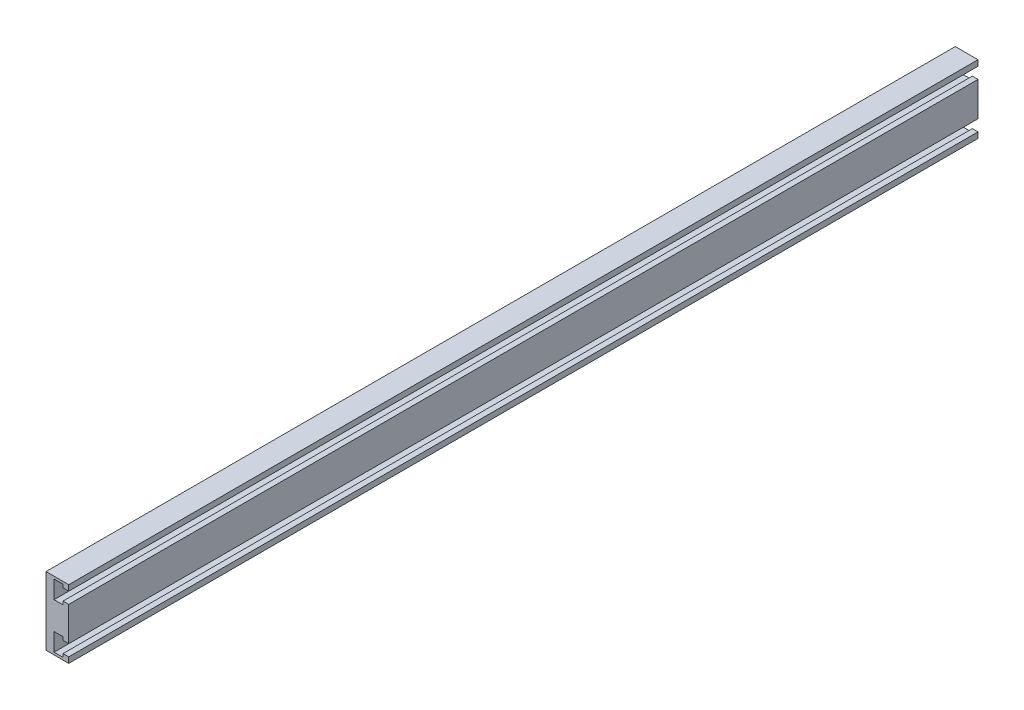
ISO-10303-21;
HEADER;
FILE_DESCRIPTION(('STEP AP214'),'2;1');
FILE_NAME('part.step','',(''),(''),'','','');
FILE_SCHEMA(('AUTOMOTIVE_DESIGN { 1 0 10303 214 1 1 1 1 }'));
ENDSEC;
DATA;
#1=APPLICATION_CONTEXT('core data for automotive mechanical design processes');
#2=APPLICATION_PROTOCOL_DEFINITION('international standard','automotive_design',2000,#1);
#3=PRODUCT_CONTEXT('',#1,'mechanical');
#4=PRODUCT('Part','Part','',(#3));
#5=PRODUCT_RELATED_PRODUCT_CATEGORY('part','',(#4));
#6=PRODUCT_DEFINITION_FORMATION('','',#4);
#7=PRODUCT_DEFINITION_CONTEXT('part definition',#1,'design');
#8=PRODUCT_DEFINITION('design','',#6,#7);
#9=PRODUCT_DEFINITION_SHAPE('','',#8);
#10=(LENGTH_UNIT() NAMED_UNIT(*) SI_UNIT(.MILLI.,.METRE.));
#11=(NAMED_UNIT(*) PLANE_ANGLE_UNIT() SI_UNIT($,.RADIAN.));
#12=(NAMED_UNIT(*) SI_UNIT($,.STERADIAN.) SOLID_ANGLE_UNIT());
#13=UNCERTAINTY_MEASURE_WITH_UNIT(LENGTH_MEASURE(1.E-05),#10,'distance_accuracy_value','');
#14=(GEOMETRIC_REPRESENTATION_CONTEXT(3) GLOBAL_UNCERTAINTY_ASSIGNED_CONTEXT((#13)) GLOBAL_UNIT_ASSIGNED_CONTEXT((#10,
#11,#12)) REPRESENTATION_CONTEXT('',''));
#15=CARTESIAN_POINT('',(0.,0.,0.));
#16=DIRECTION('',(0.,0.,1.));
#17=DIRECTION('',(1.,0.,0.));
#18=AXIS2_PLACEMENT_3D('',#15,#16,#17);
#19=CARTESIAN_POINT('',(-6.35,-19.05,-254.));
#20=DIRECTION('',(0.,-1.,0.));
#21=DIRECTION('',(0.,0.,-1.));
#22=AXIS2_PLACEMENT_3D('',#19,#20,#21);
#23=PLANE('',#22);
#24=DIRECTION('',(0.,0.,1.));
#25=VECTOR('',#24,1.);
#26=CARTESIAN_POINT('',(6.35,-19.05,-254.));
#27=LINE('',#26,#25);
#28=CARTESIAN_POINT('',(6.35,-19.05,-254.));
#29=VERTEX_POINT('',#28);
#30=CARTESIAN_POINT('',(6.35,-19.05,254.));
#31=VERTEX_POINT('',#30);
#32=EDGE_CURVE('E48',#29,#31,#27,.T.);
#33=ORIENTED_EDGE('',*,*,#32,.T.);
#34=DIRECTION('',(1.,0.,0.));
#35=VECTOR('',#34,1.);
#36=CARTESIAN_POINT('',(-6.35,-19.05,254.));
#37=LINE('',#36,#35);
#38=CARTESIAN_POINT('',(-6.35,-19.05,254.));
#39=VERTEX_POINT('',#38);
#40=EDGE_CURVE('E182',#39,#31,#37,.T.);
#41=ORIENTED_EDGE('',*,*,#40,.F.);
#42=DIRECTION('',(0.,0.,1.));
#43=VECTOR('',#42,1.);
#44=CARTESIAN_POINT('',(-6.35,-19.05,-254.));
#45=LINE('',#44,#43);
#46=CARTESIAN_POINT('',(-6.35,-19.05,-254.));
#47=VERTEX_POINT('',#46);
#48=EDGE_CURVE('E11',#47,#39,#45,.T.);
#49=ORIENTED_EDGE('',*,*,#48,.F.);
#50=DIRECTION('',(1.,0.,0.));
#51=VECTOR('',#50,1.);
#52=CARTESIAN_POINT('',(-6.35,-19.05,-254.));
#53=LINE('',#52,#51);
#54=EDGE_CURVE('E184',#47,#29,#53,.T.);
#55=ORIENTED_EDGE('',*,*,#54,.T.);
#56=EDGE_LOOP('',(#33,#41,#49,#55));
#57=FACE_BOUND('',#56,.T.);
#58=ADVANCED_FACE('F45',(#57),#23,.T.);
#59=CARTESIAN_POINT('',(-6.35,-19.05,-254.));
#60=DIRECTION('',(1.,0.,0.));
#61=DIRECTION('',(0.,0.,-1.));
#62=AXIS2_PLACEMENT_3D('',#59,#60,#61);
#63=PLANE('',#62);
#64=ORIENTED_EDGE('',*,*,#48,.T.);
#65=DIRECTION('',(0.,1.,0.));
#66=VECTOR('',#65,1.);
#67=CARTESIAN_POINT('',(-6.35,-19.05,254.));
#68=LINE('',#67,#66);
#69=CARTESIAN_POINT('',(-6.35,19.05,254.));
#70=VERTEX_POINT('',#69);
#71=EDGE_CURVE('E202',#39,#70,#68,.T.);
#72=ORIENTED_EDGE('',*,*,#71,.T.);
#73=DIRECTION('',(0.,0.,1.));
#74=VECTOR('',#73,1.);
#75=CARTESIAN_POINT('',(-6.35,19.05,-254.));
#76=LINE('',#75,#74);
#77=CARTESIAN_POINT('',(-6.35,19.05,-254.));
#78=VERTEX_POINT('',#77);
#79=EDGE_CURVE('E54',#78,#70,#76,.T.);
#80=ORIENTED_EDGE('',*,*,#79,.F.);
#81=DIRECTION('',(0.,1.,0.));
#82=VECTOR('',#81,1.);
#83=CARTESIAN_POINT('',(-6.35,-19.05,-254.));
#84=LINE('',#83,#82);
#85=EDGE_CURVE('E67',#47,#78,#84,.T.);
#86=ORIENTED_EDGE('',*,*,#85,.F.);
#87=EDGE_LOOP('',(#64,#72,#80,#86));
#88=FACE_BOUND('',#87,.T.);
#89=ADVANCED_FACE('F466',(#88),#63,.F.);
#90=CARTESIAN_POINT('',(-6.35,19.05,-254.));
#91=DIRECTION('',(0.,-1.,0.));
#92=DIRECTION('',(0.,0.,-1.));
#93=AXIS2_PLACEMENT_3D('',#90,#91,#92);
#94=PLANE('',#93);
#95=ORIENTED_EDGE('',*,*,#79,.T.);
#96=DIRECTION('',(1.,0.,0.));
#97=VECTOR('',#96,1.);
#98=CARTESIAN_POINT('',(-6.35,19.05,254.));
#99=LINE('',#98,#97);
#100=CARTESIAN_POINT('',(6.35,19.05,254.));
#101=VERTEX_POINT('',#100);
#102=EDGE_CURVE('E268',#70,#101,#99,.T.);
#103=ORIENTED_EDGE('',*,*,#102,.T.);
#104=DIRECTION('',(0.,0.,1.));
#105=VECTOR('',#104,1.);
#106=CARTESIAN_POINT('',(6.35,19.05,-254.));
#107=LINE('',#106,#105);
#108=CARTESIAN_POINT('',(6.35,19.05,-254.));
#109=VERTEX_POINT('',#108);
#110=EDGE_CURVE('E341',#109,#101,#107,.T.);
#111=ORIENTED_EDGE('',*,*,#110,.F.);
#112=DIRECTION('',(1.,0.,0.));
#113=VECTOR('',#112,1.);
#114=CARTESIAN_POINT('',(-6.35,19.05,-254.));
#115=LINE('',#114,#113);
#116=EDGE_CURVE('E334',#78,#109,#115,.T.);
#117=ORIENTED_EDGE('',*,*,#116,.F.);
#118=EDGE_LOOP('',(#95,#103,#111,#117));
#119=FACE_BOUND('',#118,.T.);
#120=ADVANCED_FACE('F463',(#119),#94,.F.);
#121=CARTESIAN_POINT('',(6.35,15.875,-254.));
#122=DIRECTION('',(1.,0.,0.));
#123=DIRECTION('',(0.,1.,0.));
#124=AXIS2_PLACEMENT_3D('',#121,#122,#123);
#125=PLANE('',#124);
#126=ORIENTED_EDGE('',*,*,#110,.T.);
#127=DIRECTION('',(0.,1.,0.));
#128=VECTOR('',#127,1.);
#129=CARTESIAN_POINT('',(6.35,15.875,254.));
#130=LINE('',#129,#128);
#131=CARTESIAN_POINT('',(6.35,15.875,254.));
#132=VERTEX_POINT('',#131);
#133=EDGE_CURVE('E264',#132,#101,#130,.T.);
#134=ORIENTED_EDGE('',*,*,#133,.F.);
#135=DIRECTION('',(0.,0.,1.));
#136=VECTOR('',#135,1.);
#137=CARTESIAN_POINT('',(6.35,15.875,-254.));
#138=LINE('',#137,#136);
#139=CARTESIAN_POINT('',(6.35,15.875,-254.));
#140=VERTEX_POINT('',#139);
#141=EDGE_CURVE('E344',#140,#132,#138,.T.);
#142=ORIENTED_EDGE('',*,*,#141,.F.);
#143=DIRECTION('',(0.,1.,0.));
#144=VECTOR('',#143,1.);
#145=CARTESIAN_POINT('',(6.35,15.875,-254.));
#146=LINE('',#145,#144);
#147=EDGE_CURVE('E330',#140,#109,#146,.T.);
#148=ORIENTED_EDGE('',*,*,#147,.T.);
#149=EDGE_LOOP('',(#126,#134,#142,#148));
#150=FACE_BOUND('',#149,.T.);
#151=ADVANCED_FACE('F473',(#150),#125,.T.);
#152=CARTESIAN_POINT('',(6.35,15.875,-254.));
#153=DIRECTION('',(0.,1.,0.));
#154=DIRECTION('',(0.,0.,1.));
#155=AXIS2_PLACEMENT_3D('',#152,#153,#154);
#156=PLANE('',#155);
#157=ORIENTED_EDGE('',*,*,#141,.T.);
#158=DIRECTION('',(-1.,0.,0.));
#159=VECTOR('',#158,1.);
#160=CARTESIAN_POINT('',(6.35,15.875,254.));
#161=LINE('',#160,#159);
#162=CARTESIAN_POINT('',(3.175,15.875,254.));
#163=VERTEX_POINT('',#162);
#164=EDGE_CURVE('E260',#132,#163,#161,.T.);
#165=ORIENTED_EDGE('',*,*,#164,.T.);
#166=DIRECTION('',(0.,0.,1.));
#167=VECTOR('',#166,1.);
#168=CARTESIAN_POINT('',(3.175,15.875,-254.));
#169=LINE('',#168,#167);
#170=CARTESIAN_POINT('',(3.175,15.875,-254.));
#171=VERTEX_POINT('',#170);
#172=EDGE_CURVE('E347',#171,#163,#169,.T.);
#173=ORIENTED_EDGE('',*,*,#172,.F.);
#174=DIRECTION('',(-1.,0.,0.));
#175=VECTOR('',#174,1.);
#176=CARTESIAN_POINT('',(6.35,15.875,-254.));
#177=LINE('',#176,#175);
#178=EDGE_CURVE('E327',#140,#171,#177,.T.);
#179=ORIENTED_EDGE('',*,*,#178,.F.);
#180=EDGE_LOOP('',(#157,#165,#173,#179));
#181=FACE_BOUND('',#180,.T.);
#182=ADVANCED_FACE('F457',(#181),#156,.F.);
#183=CARTESIAN_POINT('',(3.175,15.875,-254.));
#184=DIRECTION('',(1.,0.,0.));
#185=DIRECTION('',(0.,1.,0.));
#186=AXIS2_PLACEMENT_3D('',#183,#184,#185);
#187=PLANE('',#186);
#188=ORIENTED_EDGE('',*,*,#172,.T.);
#189=DIRECTION('',(0.,1.,0.));
#190=VECTOR('',#189,1.);
#191=CARTESIAN_POINT('',(3.175,15.875,254.));
#192=LINE('',#191,#190);
#193=CARTESIAN_POINT('',(3.175,17.7,254.));
#194=VERTEX_POINT('',#193);
#195=EDGE_CURVE('E256',#163,#194,#192,.T.);
#196=ORIENTED_EDGE('',*,*,#195,.T.);
#197=DIRECTION('',(0.,0.,1.));
#198=VECTOR('',#197,1.);
#199=CARTESIAN_POINT('',(3.175,17.7,-254.));
#200=LINE('',#199,#198);
#201=CARTESIAN_POINT('',(3.175,17.7,-254.));
#202=VERTEX_POINT('',#201);
#203=EDGE_CURVE('E350',#202,#194,#200,.T.);
#204=ORIENTED_EDGE('',*,*,#203,.F.);
#205=DIRECTION('',(0.,1.,0.));
#206=VECTOR('',#205,1.);
#207=CARTESIAN_POINT('',(3.175,15.875,-254.));
#208=LINE('',#207,#206);
#209=EDGE_CURVE('E324',#171,#202,#208,.T.);
#210=ORIENTED_EDGE('',*,*,#209,.F.);
#211=EDGE_LOOP('',(#188,#196,#204,#210));
#212=FACE_BOUND('',#211,.T.);
#213=ADVANCED_FACE('F452',(#212),#187,.F.);
#214=CARTESIAN_POINT('',(3.175,17.7,-254.));
#215=DIRECTION('',(0.,1.,0.));
#216=DIRECTION('',(0.,0.,1.));
#217=AXIS2_PLACEMENT_3D('',#214,#215,#216);
#218=PLANE('',#217);
#219=ORIENTED_EDGE('',*,*,#203,.T.);
#220=DIRECTION('',(-1.,0.,0.));
#221=VECTOR('',#220,1.);
#222=CARTESIAN_POINT('',(3.175,17.7,254.));
#223=LINE('',#222,#221);
#224=CARTESIAN_POINT('',(-1.825,17.7,254.));
#225=VERTEX_POINT('',#224);
#226=EDGE_CURVE('E252',#194,#225,#223,.T.);
#227=ORIENTED_EDGE('',*,*,#226,.T.);
#228=DIRECTION('',(0.,0.,1.));
#229=VECTOR('',#228,1.);
#230=CARTESIAN_POINT('',(-1.825,17.7,-254.));
#231=LINE('',#230,#229);
#232=CARTESIAN_POINT('',(-1.825,17.7,-254.));
#233=VERTEX_POINT('',#232);
#234=EDGE_CURVE('E353',#233,#225,#231,.T.);
#235=ORIENTED_EDGE('',*,*,#234,.F.);
#236=DIRECTION('',(-1.,0.,0.));
#237=VECTOR('',#236,1.);
#238=CARTESIAN_POINT('',(3.175,17.7,-254.));
#239=LINE('',#238,#237);
#240=EDGE_CURVE('E321',#202,#233,#239,.T.);
#241=ORIENTED_EDGE('',*,*,#240,.F.);
#242=EDGE_LOOP('',(#219,#227,#235,#241));
#243=FACE_BOUND('',#242,.T.);
#244=ADVANCED_FACE('F447',(#243),#218,.F.);
#245=CARTESIAN_POINT('',(-1.825,17.7,-254.));
#246=DIRECTION('',(-1.,0.,0.));
#247=DIRECTION('',(0.,-1.,0.));
#248=AXIS2_PLACEMENT_3D('',#245,#246,#247);
#249=PLANE('',#248);
#250=ORIENTED_EDGE('',*,*,#234,.T.);
#251=DIRECTION('',(0.,-1.,0.));
#252=VECTOR('',#251,1.);
#253=CARTESIAN_POINT('',(-1.825,17.7,254.));
#254=LINE('',#253,#252);
#255=CARTESIAN_POINT('',(-1.825,7.7,254.));
#256=VERTEX_POINT('',#255);
#257=EDGE_CURVE('E248',#225,#256,#254,.T.);
#258=ORIENTED_EDGE('',*,*,#257,.T.);
#259=DIRECTION('',(0.,0.,1.));
#260=VECTOR('',#259,1.);
#261=CARTESIAN_POINT('',(-1.825,7.7,-254.));
#262=LINE('',#261,#260);
#263=CARTESIAN_POINT('',(-1.825,7.7,-254.));
#264=VERTEX_POINT('',#263);
#265=EDGE_CURVE('E356',#264,#256,#262,.T.);
#266=ORIENTED_EDGE('',*,*,#265,.F.);
#267=DIRECTION('',(0.,-1.,0.));
#268=VECTOR('',#267,1.);
#269=CARTESIAN_POINT('',(-1.825,17.7,-254.));
#270=LINE('',#269,#268);
#271=EDGE_CURVE('E318',#233,#264,#270,.T.);
#272=ORIENTED_EDGE('',*,*,#271,.F.);
#273=EDGE_LOOP('',(#250,#258,#266,#272));
#274=FACE_BOUND('',#273,.T.);
#275=ADVANCED_FACE('F442',(#274),#249,.F.);
#276=CARTESIAN_POINT('',(-1.825,7.7,-254.));
#277=DIRECTION('',(0.,-1.,0.));
#278=DIRECTION('',(0.,0.,-1.));
#279=AXIS2_PLACEMENT_3D('',#276,#277,#278);
#280=PLANE('',#279);
#281=ORIENTED_EDGE('',*,*,#265,.T.);
#282=DIRECTION('',(1.,0.,0.));
#283=VECTOR('',#282,1.);
#284=CARTESIAN_POINT('',(-1.825,7.7,254.));
#285=LINE('',#284,#283);
#286=CARTESIAN_POINT('',(3.175,7.7,254.));
#287=VERTEX_POINT('',#286);
#288=EDGE_CURVE('E244',#256,#287,#285,.T.);
#289=ORIENTED_EDGE('',*,*,#288,.T.);
#290=DIRECTION('',(0.,0.,1.));
#291=VECTOR('',#290,1.);
#292=CARTESIAN_POINT('',(3.175,7.7,-254.));
#293=LINE('',#292,#291);
#294=CARTESIAN_POINT('',(3.175,7.7,-254.));
#295=VERTEX_POINT('',#294);
#296=EDGE_CURVE('E359',#295,#287,#293,.T.);
#297=ORIENTED_EDGE('',*,*,#296,.F.);
#298=DIRECTION('',(1.,0.,0.));
#299=VECTOR('',#298,1.);
#300=CARTESIAN_POINT('',(-1.825,7.7,-254.));
#301=LINE('',#300,#299);
#302=EDGE_CURVE('E315',#264,#295,#301,.T.);
#303=ORIENTED_EDGE('',*,*,#302,.F.);
#304=EDGE_LOOP('',(#281,#289,#297,#303));
#305=FACE_BOUND('',#304,.T.);
#306=ADVANCED_FACE('F437',(#305),#280,.F.);
#307=CARTESIAN_POINT('',(3.175,7.7,-254.));
#308=DIRECTION('',(1.,0.,0.));
#309=DIRECTION('',(0.,0.,-1.));
#310=AXIS2_PLACEMENT_3D('',#307,#308,#309);
#311=PLANE('',#310);
#312=ORIENTED_EDGE('',*,*,#296,.T.);
#313=DIRECTION('',(0.,1.,0.));
#314=VECTOR('',#313,1.);
#315=CARTESIAN_POINT('',(3.175,7.7,254.));
#316=LINE('',#315,#314);
#317=CARTESIAN_POINT('',(3.175,9.525,254.));
#318=VERTEX_POINT('',#317);
#319=EDGE_CURVE('E240',#287,#318,#316,.T.);
#320=ORIENTED_EDGE('',*,*,#319,.T.);
#321=DIRECTION('',(0.,0.,1.));
#322=VECTOR('',#321,1.);
#323=CARTESIAN_POINT('',(3.175,9.525,-254.));
#324=LINE('',#323,#322);
#325=CARTESIAN_POINT('',(3.175,9.525,-254.));
#326=VERTEX_POINT('',#325);
#327=EDGE_CURVE('E362',#326,#318,#324,.T.);
#328=ORIENTED_EDGE('',*,*,#327,.F.);
#329=DIRECTION('',(0.,1.,0.));
#330=VECTOR('',#329,1.);
#331=CARTESIAN_POINT('',(3.175,7.7,-254.));
#332=LINE('',#331,#330);
#333=EDGE_CURVE('E312',#295,#326,#332,.T.);
#334=ORIENTED_EDGE('',*,*,#333,.F.);
#335=EDGE_LOOP('',(#312,#320,#328,#334));
#336=FACE_BOUND('',#335,.T.);
#337=ADVANCED_FACE('F432',(#336),#311,.F.);
#338=CARTESIAN_POINT('',(3.175,9.525,-254.));
#339=DIRECTION('',(0.,-1.,0.));
#340=DIRECTION('',(0.,0.,-1.));
#341=AXIS2_PLACEMENT_3D('',#338,#339,#340);
#342=PLANE('',#341);
#343=ORIENTED_EDGE('',*,*,#327,.T.);
#344=DIRECTION('',(1.,0.,0.));
#345=VECTOR('',#344,1.);
#346=CARTESIAN_POINT('',(3.175,9.525,254.));
#347=LINE('',#346,#345);
#348=CARTESIAN_POINT('',(6.35,9.525,254.));
#349=VERTEX_POINT('',#348);
#350=EDGE_CURVE('E236',#318,#349,#347,.T.);
#351=ORIENTED_EDGE('',*,*,#350,.T.);
#352=DIRECTION('',(0.,0.,1.));
#353=VECTOR('',#352,1.);
#354=CARTESIAN_POINT('',(6.35,9.525,-254.));
#355=LINE('',#354,#353);
#356=CARTESIAN_POINT('',(6.35,9.525,-254.));
#357=VERTEX_POINT('',#356);
#358=EDGE_CURVE('E365',#357,#349,#355,.T.);
#359=ORIENTED_EDGE('',*,*,#358,.F.);
#360=DIRECTION('',(1.,0.,0.));
#361=VECTOR('',#360,1.);
#362=CARTESIAN_POINT('',(3.175,9.525,-254.));
#363=LINE('',#362,#361);
#364=EDGE_CURVE('E309',#326,#357,#363,.T.);
#365=ORIENTED_EDGE('',*,*,#364,.F.);
#366=EDGE_LOOP('',(#343,#351,#359,#365));
#367=FACE_BOUND('',#366,.T.);
#368=ADVANCED_FACE('F427',(#367),#342,.F.);
#369=CARTESIAN_POINT('',(6.35,9.525,-254.));
#370=DIRECTION('',(-1.,0.,0.));
#371=DIRECTION('',(0.,-1.,0.));
#372=AXIS2_PLACEMENT_3D('',#369,#370,#371);
#373=PLANE('',#372);
#374=ORIENTED_EDGE('',*,*,#358,.T.);
#375=DIRECTION('',(0.,-1.,0.));
#376=VECTOR('',#375,1.);
#377=CARTESIAN_POINT('',(6.35,9.525,254.));
#378=LINE('',#377,#376);
#379=CARTESIAN_POINT('',(6.35,-9.525,254.));
#380=VERTEX_POINT('',#379);
#381=EDGE_CURVE('E232',#349,#380,#378,.T.);
#382=ORIENTED_EDGE('',*,*,#381,.T.);
#383=DIRECTION('',(0.,0.,1.));
#384=VECTOR('',#383,1.);
#385=CARTESIAN_POINT('',(6.35,-9.525,-254.));
#386=LINE('',#385,#384);
#387=CARTESIAN_POINT('',(6.35,-9.525,-254.));
#388=VERTEX_POINT('',#387);
#389=EDGE_CURVE('E368',#388,#380,#386,.T.);
#390=ORIENTED_EDGE('',*,*,#389,.F.);
#391=DIRECTION('',(0.,-1.,0.));
#392=VECTOR('',#391,1.);
#393=CARTESIAN_POINT('',(6.35,9.525,-254.));
#394=LINE('',#393,#392);
#395=EDGE_CURVE('E306',#357,#388,#394,.T.);
#396=ORIENTED_EDGE('',*,*,#395,.F.);
#397=EDGE_LOOP('',(#374,#382,#390,#396));
#398=FACE_BOUND('',#397,.T.);
#399=ADVANCED_FACE('F423',(#398),#373,.F.);
#400=CARTESIAN_POINT('',(6.35,-9.525,-254.));
#401=DIRECTION('',(0.,1.,0.));
#402=DIRECTION('',(0.,0.,1.));
#403=AXIS2_PLACEMENT_3D('',#400,#401,#402);
#404=PLANE('',#403);
#405=ORIENTED_EDGE('',*,*,#389,.T.);
#406=DIRECTION('',(-1.,0.,0.));
#407=VECTOR('',#406,1.);
#408=CARTESIAN_POINT('',(6.35,-9.525,254.));
#409=LINE('',#408,#407);
#410=CARTESIAN_POINT('',(3.175,-9.525,254.));
#411=VERTEX_POINT('',#410);
#412=EDGE_CURVE('E228',#380,#411,#409,.T.);
#413=ORIENTED_EDGE('',*,*,#412,.T.);
#414=DIRECTION('',(0.,0.,1.));
#415=VECTOR('',#414,1.);
#416=CARTESIAN_POINT('',(3.175,-9.525,-254.));
#417=LINE('',#416,#415);
#418=CARTESIAN_POINT('',(3.175,-9.525,-254.));
#419=VERTEX_POINT('',#418);
#420=EDGE_CURVE('E371',#419,#411,#417,.T.);
#421=ORIENTED_EDGE('',*,*,#420,.F.);
#422=DIRECTION('',(-1.,0.,0.));
#423=VECTOR('',#422,1.);
#424=CARTESIAN_POINT('',(6.35,-9.525,-254.));
#425=LINE('',#424,#423);
#426=EDGE_CURVE('E303',#388,#419,#425,.T.);
#427=ORIENTED_EDGE('',*,*,#426,.F.);
#428=EDGE_LOOP('',(#405,#413,#421,#427));
#429=FACE_BOUND('',#428,.T.);
#430=ADVANCED_FACE('F418',(#429),#404,.F.);
#431=CARTESIAN_POINT('',(3.175,-7.7,-254.));
#432=DIRECTION('',(-1.,0.,0.));
#433=DIRECTION('',(0.,-1.,0.));
#434=AXIS2_PLACEMENT_3D('',#431,#432,#433);
#435=PLANE('',#434);
#436=ORIENTED_EDGE('',*,*,#420,.T.);
#437=DIRECTION('',(0.,-1.,0.));
#438=VECTOR('',#437,1.);
#439=CARTESIAN_POINT('',(3.175,-7.7,254.));
#440=LINE('',#439,#438);
#441=CARTESIAN_POINT('',(3.175,-7.7,254.));
#442=VERTEX_POINT('',#441);
#443=EDGE_CURVE('E224',#442,#411,#440,.T.);
#444=ORIENTED_EDGE('',*,*,#443,.F.);
#445=DIRECTION('',(0.,0.,1.));
#446=VECTOR('',#445,1.);
#447=CARTESIAN_POINT('',(3.175,-7.7,-254.));
#448=LINE('',#447,#446);
#449=CARTESIAN_POINT('',(3.175,-7.7,-254.));
#450=VERTEX_POINT('',#449);
#451=EDGE_CURVE('E374',#450,#442,#448,.T.);
#452=ORIENTED_EDGE('',*,*,#451,.F.);
#453=DIRECTION('',(0.,-1.,0.));
#454=VECTOR('',#453,1.);
#455=CARTESIAN_POINT('',(3.175,-7.7,-254.));
#456=LINE('',#455,#454);
#457=EDGE_CURVE('E299',#450,#419,#456,.T.);
#458=ORIENTED_EDGE('',*,*,#457,.T.);
#459=EDGE_LOOP('',(#436,#444,#452,#458));
#460=FACE_BOUND('',#459,.T.);
#461=ADVANCED_FACE('F412',(#460),#435,.T.);
#462=CARTESIAN_POINT('',(-1.825,-7.7,-254.));
#463=DIRECTION('',(0.,-1.,0.));
#464=DIRECTION('',(1.,0.,0.));
#465=AXIS2_PLACEMENT_3D('',#462,#463,#464);
#466=PLANE('',#465);
#467=ORIENTED_EDGE('',*,*,#451,.T.);
#468=DIRECTION('',(1.,0.,0.));
#469=VECTOR('',#468,1.);
#470=CARTESIAN_POINT('',(-1.825,-7.7,254.));
#471=LINE('',#470,#469);
#472=CARTESIAN_POINT('',(-1.825,-7.7,254.));
#473=VERTEX_POINT('',#472);
#474=EDGE_CURVE('E220',#473,#442,#471,.T.);
#475=ORIENTED_EDGE('',*,*,#474,.F.);
#476=DIRECTION('',(0.,0.,1.));
#477=VECTOR('',#476,1.);
#478=CARTESIAN_POINT('',(-1.825,-7.7,-254.));
#479=LINE('',#478,#477);
#480=CARTESIAN_POINT('',(-1.825,-7.7,-254.));
#481=VERTEX_POINT('',#480);
#482=EDGE_CURVE('E377',#481,#473,#479,.T.);
#483=ORIENTED_EDGE('',*,*,#482,.F.);
#484=DIRECTION('',(1.,0.,0.));
#485=VECTOR('',#484,1.);
#486=CARTESIAN_POINT('',(-1.825,-7.7,-254.));
#487=LINE('',#486,#485);
#488=EDGE_CURVE('E295',#481,#450,#487,.T.);
#489=ORIENTED_EDGE('',*,*,#488,.T.);
#490=EDGE_LOOP('',(#467,#475,#483,#489));
#491=FACE_BOUND('',#490,.T.);
#492=ADVANCED_FACE('F410',(#491),#466,.T.);
#493=CARTESIAN_POINT('',(-1.825,-17.7,-254.));
#494=DIRECTION('',(1.,0.,0.));
#495=DIRECTION('',(0.,0.,-1.));
#496=AXIS2_PLACEMENT_3D('',#493,#494,#495);
#497=PLANE('',#496);
#498=ORIENTED_EDGE('',*,*,#482,.T.);
#499=DIRECTION('',(0.,1.,0.));
#500=VECTOR('',#499,1.);
#501=CARTESIAN_POINT('',(-1.825,-17.7,254.));
#502=LINE('',#501,#500);
#503=CARTESIAN_POINT('',(-1.825,-17.7,254.));
#504=VERTEX_POINT('',#503);
#505=EDGE_CURVE('E216',#504,#473,#502,.T.);
#506=ORIENTED_EDGE('',*,*,#505,.F.);
#507=DIRECTION('',(0.,0.,1.));
#508=VECTOR('',#507,1.);
#509=CARTESIAN_POINT('',(-1.825,-17.7,-254.));
#510=LINE('',#509,#508);
#511=CARTESIAN_POINT('',(-1.825,-17.7,-254.));
#512=VERTEX_POINT('',#511);
#513=EDGE_CURVE('E380',#512,#504,#510,.T.);
#514=ORIENTED_EDGE('',*,*,#513,.F.);
#515=DIRECTION('',(0.,1.,0.));
#516=VECTOR('',#515,1.);
#517=CARTESIAN_POINT('',(-1.825,-17.7,-254.));
#518=LINE('',#517,#516);
#519=EDGE_CURVE('E291',#512,#481,#518,.T.);
#520=ORIENTED_EDGE('',*,*,#519,.T.);
#521=EDGE_LOOP('',(#498,#506,#514,#520));
#522=FACE_BOUND('',#521,.T.);
#523=ADVANCED_FACE('F405',(#522),#497,.T.);
#524=CARTESIAN_POINT('',(3.175,-17.7,-254.));
#525=DIRECTION('',(0.,1.,0.));
#526=DIRECTION('',(-1.,0.,0.));
#527=AXIS2_PLACEMENT_3D('',#524,#525,#526);
#528=PLANE('',#527);
#529=ORIENTED_EDGE('',*,*,#513,.T.);
#530=DIRECTION('',(-1.,0.,0.));
#531=VECTOR('',#530,1.);
#532=CARTESIAN_POINT('',(3.175,-17.7,254.));
#533=LINE('',#532,#531);
#534=CARTESIAN_POINT('',(3.175,-17.7,254.));
#535=VERTEX_POINT('',#534);
#536=EDGE_CURVE('E212',#535,#504,#533,.T.);
#537=ORIENTED_EDGE('',*,*,#536,.F.);
#538=DIRECTION('',(0.,0.,1.));
#539=VECTOR('',#538,1.);
#540=CARTESIAN_POINT('',(3.175,-17.7,-254.));
#541=LINE('',#540,#539);
#542=CARTESIAN_POINT('',(3.175,-17.7,-254.));
#543=VERTEX_POINT('',#542);
#544=EDGE_CURVE('E383',#543,#535,#541,.T.);
#545=ORIENTED_EDGE('',*,*,#544,.F.);
#546=DIRECTION('',(-1.,0.,0.));
#547=VECTOR('',#546,1.);
#548=CARTESIAN_POINT('',(3.175,-17.7,-254.));
#549=LINE('',#548,#547);
#550=EDGE_CURVE('E287',#543,#512,#549,.T.);
#551=ORIENTED_EDGE('',*,*,#550,.T.);
#552=EDGE_LOOP('',(#529,#537,#545,#551));
#553=FACE_BOUND('',#552,.T.);
#554=ADVANCED_FACE('F399',(#553),#528,.T.);
#555=CARTESIAN_POINT('',(3.175,-15.875,-254.));
#556=DIRECTION('',(-1.,0.,0.));
#557=DIRECTION('',(0.,-1.,0.));
#558=AXIS2_PLACEMENT_3D('',#555,#556,#557);
#559=PLANE('',#558);
#560=ORIENTED_EDGE('',*,*,#544,.T.);
#561=DIRECTION('',(0.,-1.,0.));
#562=VECTOR('',#561,1.);
#563=CARTESIAN_POINT('',(3.175,-15.875,254.));
#564=LINE('',#563,#562);
#565=CARTESIAN_POINT('',(3.175,-15.875,254.));
#566=VERTEX_POINT('',#565);
#567=EDGE_CURVE('E208',#566,#535,#564,.T.);
#568=ORIENTED_EDGE('',*,*,#567,.F.);
#569=DIRECTION('',(0.,0.,1.));
#570=VECTOR('',#569,1.);
#571=CARTESIAN_POINT('',(3.175,-15.875,-254.));
#572=LINE('',#571,#570);
#573=CARTESIAN_POINT('',(3.175,-15.875,-254.));
#574=VERTEX_POINT('',#573);
#575=EDGE_CURVE('E386',#574,#566,#572,.T.);
#576=ORIENTED_EDGE('',*,*,#575,.F.);
#577=DIRECTION('',(0.,-1.,0.));
#578=VECTOR('',#577,1.);
#579=CARTESIAN_POINT('',(3.175,-15.875,-254.));
#580=LINE('',#579,#578);
#581=EDGE_CURVE('E283',#574,#543,#580,.T.);
#582=ORIENTED_EDGE('',*,*,#581,.T.);
#583=EDGE_LOOP('',(#560,#568,#576,#582));
#584=FACE_BOUND('',#583,.T.);
#585=ADVANCED_FACE('F396',(#584),#559,.T.);
#586=CARTESIAN_POINT('',(6.35,-15.875,-254.));
#587=DIRECTION('',(0.,1.,0.));
#588=DIRECTION('',(0.,0.,1.));
#589=AXIS2_PLACEMENT_3D('',#586,#587,#588);
#590=PLANE('',#589);
#591=ORIENTED_EDGE('',*,*,#575,.T.);
#592=DIRECTION('',(-1.,0.,0.));
#593=VECTOR('',#592,1.);
#594=CARTESIAN_POINT('',(6.35,-15.875,254.));
#595=LINE('',#594,#593);
#596=CARTESIAN_POINT('',(6.35,-15.875,254.));
#597=VERTEX_POINT('',#596);
#598=EDGE_CURVE('E197',#597,#566,#595,.T.);
#599=ORIENTED_EDGE('',*,*,#598,.F.);
#600=DIRECTION('',(0.,0.,1.));
#601=VECTOR('',#600,1.);
#602=CARTESIAN_POINT('',(6.35,-15.875,-254.));
#603=LINE('',#602,#601);
#604=CARTESIAN_POINT('',(6.35,-15.875,-254.));
#605=VERTEX_POINT('',#604);
#606=EDGE_CURVE('E189',#605,#597,#603,.T.);
#607=ORIENTED_EDGE('',*,*,#606,.F.);
#608=DIRECTION('',(-1.,0.,0.));
#609=VECTOR('',#608,1.);
#610=CARTESIAN_POINT('',(6.35,-15.875,-254.));
#611=LINE('',#610,#609);
#612=EDGE_CURVE('E279',#605,#574,#611,.T.);
#613=ORIENTED_EDGE('',*,*,#612,.T.);
#614=EDGE_LOOP('',(#591,#599,#607,#613));
#615=FACE_BOUND('',#614,.T.);
#616=ADVANCED_FACE('F390',(#615),#590,.T.);
#617=CARTESIAN_POINT('',(6.35,-19.05,-254.));
#618=DIRECTION('',(1.,0.,0.));
#619=DIRECTION('',(0.,0.,-1.));
#620=AXIS2_PLACEMENT_3D('',#617,#618,#619);
#621=PLANE('',#620);
#622=ORIENTED_EDGE('',*,*,#606,.T.);
#623=DIRECTION('',(0.,1.,0.));
#624=VECTOR('',#623,1.);
#625=CARTESIAN_POINT('',(6.35,-19.05,254.));
#626=LINE('',#625,#624);
#627=EDGE_CURVE('E191',#31,#597,#626,.T.);
#628=ORIENTED_EDGE('',*,*,#627,.F.);
#629=ORIENTED_EDGE('',*,*,#32,.F.);
#630=DIRECTION('',(0.,1.,0.));
#631=VECTOR('',#630,1.);
#632=CARTESIAN_POINT('',(6.35,-19.05,-254.));
#633=LINE('',#632,#631);
#634=EDGE_CURVE('E276',#29,#605,#633,.T.);
#635=ORIENTED_EDGE('',*,*,#634,.T.);
#636=EDGE_LOOP('',(#622,#628,#629,#635));
#637=FACE_BOUND('',#636,.T.);
#638=ADVANCED_FACE('F192',(#637),#621,.T.);
#639=CARTESIAN_POINT('',(0.,0.,-254.));
#640=DIRECTION('',(0.,0.,1.));
#641=DIRECTION('',(1.,0.,0.));
#642=AXIS2_PLACEMENT_3D('',#639,#640,#641);
#643=PLANE('',#642);
#644=ORIENTED_EDGE('',*,*,#54,.F.);
#645=ORIENTED_EDGE('',*,*,#85,.T.);
#646=ORIENTED_EDGE('',*,*,#116,.T.);
#647=ORIENTED_EDGE('',*,*,#147,.F.);
#648=ORIENTED_EDGE('',*,*,#178,.T.);
#649=ORIENTED_EDGE('',*,*,#209,.T.);
#650=ORIENTED_EDGE('',*,*,#240,.T.);
#651=ORIENTED_EDGE('',*,*,#271,.T.);
#652=ORIENTED_EDGE('',*,*,#302,.T.);
#653=ORIENTED_EDGE('',*,*,#333,.T.);
#654=ORIENTED_EDGE('',*,*,#364,.T.);
#655=ORIENTED_EDGE('',*,*,#395,.T.);
#656=ORIENTED_EDGE('',*,*,#426,.T.);
#657=ORIENTED_EDGE('',*,*,#457,.F.);
#658=ORIENTED_EDGE('',*,*,#488,.F.);
#659=ORIENTED_EDGE('',*,*,#519,.F.);
#660=ORIENTED_EDGE('',*,*,#550,.F.);
#661=ORIENTED_EDGE('',*,*,#581,.F.);
#662=ORIENTED_EDGE('',*,*,#612,.F.);
#663=ORIENTED_EDGE('',*,*,#634,.F.);
#664=EDGE_LOOP('',(#644,#645,#646,#647,#648,#649,#650,#651,#652,#653,#654,#655,#656,#657,#658,
#659,#660,#661,#662,#663));
#665=FACE_BOUND('',#664,.T.);
#666=ADVANCED_FACE('F401',(#665),#643,.F.);
#667=CARTESIAN_POINT('',(0.,0.,254.));
#668=DIRECTION('',(0.,0.,1.));
#669=DIRECTION('',(1.,0.,0.));
#670=AXIS2_PLACEMENT_3D('',#667,#668,#669);
#671=PLANE('',#670);
#672=ORIENTED_EDGE('',*,*,#40,.T.);
#673=ORIENTED_EDGE('',*,*,#627,.T.);
#674=ORIENTED_EDGE('',*,*,#598,.T.);
#675=ORIENTED_EDGE('',*,*,#567,.T.);
#676=ORIENTED_EDGE('',*,*,#536,.T.);
#677=ORIENTED_EDGE('',*,*,#505,.T.);
#678=ORIENTED_EDGE('',*,*,#474,.T.);
#679=ORIENTED_EDGE('',*,*,#443,.T.);
#680=ORIENTED_EDGE('',*,*,#412,.F.);
#681=ORIENTED_EDGE('',*,*,#381,.F.);
#682=ORIENTED_EDGE('',*,*,#350,.F.);
#683=ORIENTED_EDGE('',*,*,#319,.F.);
#684=ORIENTED_EDGE('',*,*,#288,.F.);
#685=ORIENTED_EDGE('',*,*,#257,.F.);
#686=ORIENTED_EDGE('',*,*,#226,.F.);
#687=ORIENTED_EDGE('',*,*,#195,.F.);
#688=ORIENTED_EDGE('',*,*,#164,.F.);
#689=ORIENTED_EDGE('',*,*,#133,.T.);
#690=ORIENTED_EDGE('',*,*,#102,.F.);
#691=ORIENTED_EDGE('',*,*,#71,.F.);
#692=EDGE_LOOP('',(#672,#673,#674,#675,#676,#677,#678,#679,#680,#681,#682,#683,#684,#685,#686,
#687,#688,#689,#690,#691));
#693=FACE_BOUND('',#692,.T.);
#694=ADVANCED_FACE('F199',(#693),#671,.T.);
#695=CLOSED_SHELL('',(#58,#89,#120,#151,#182,#213,#244,#275,#306,#337,#368,#399,#430,#461,#492,
#523,#554,#585,#616,#638,#666,#694));
#696=MANIFOLD_SOLID_BREP('B2',#695);
#697=ADVANCED_BREP_SHAPE_REPRESENTATION('',(#18,#696),#14);
#698=SHAPE_DEFINITION_REPRESENTATION(#9,#697);
ENDSEC;
END-ISO-10303-21;
